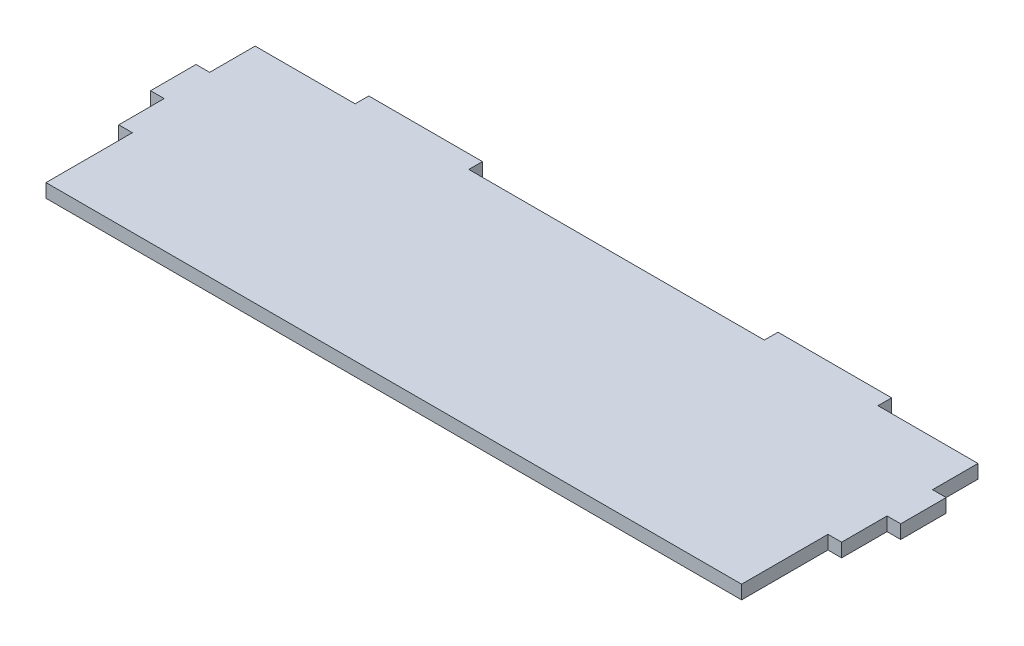
ISO-10303-21;
HEADER;
FILE_DESCRIPTION(('STEP AP214'),'2;1');
FILE_NAME('part.step','',(''),(''),'','','');
FILE_SCHEMA(('AUTOMOTIVE_DESIGN { 1 0 10303 214 1 1 1 1 }'));
ENDSEC;
DATA;
#1=APPLICATION_CONTEXT('core data for automotive mechanical design processes');
#2=APPLICATION_PROTOCOL_DEFINITION('international standard','automotive_design',2000,#1);
#3=PRODUCT_CONTEXT('',#1,'mechanical');
#4=PRODUCT('Part','Part','',(#3));
#5=PRODUCT_RELATED_PRODUCT_CATEGORY('part','',(#4));
#6=PRODUCT_DEFINITION_FORMATION('','',#4);
#7=PRODUCT_DEFINITION_CONTEXT('part definition',#1,'design');
#8=PRODUCT_DEFINITION('design','',#6,#7);
#9=PRODUCT_DEFINITION_SHAPE('','',#8);
#10=(LENGTH_UNIT() NAMED_UNIT(*) SI_UNIT(.MILLI.,.METRE.));
#11=(NAMED_UNIT(*) PLANE_ANGLE_UNIT() SI_UNIT($,.RADIAN.));
#12=(NAMED_UNIT(*) SI_UNIT($,.STERADIAN.) SOLID_ANGLE_UNIT());
#13=UNCERTAINTY_MEASURE_WITH_UNIT(LENGTH_MEASURE(1.E-05),#10,'distance_accuracy_value','');
#14=(GEOMETRIC_REPRESENTATION_CONTEXT(3) GLOBAL_UNCERTAINTY_ASSIGNED_CONTEXT((#13)) GLOBAL_UNIT_ASSIGNED_CONTEXT((#10,
#11,#12)) REPRESENTATION_CONTEXT('',''));
#15=CARTESIAN_POINT('',(0.,0.,0.));
#16=DIRECTION('',(0.,0.,1.));
#17=DIRECTION('',(1.,0.,0.));
#18=AXIS2_PLACEMENT_3D('',#15,#16,#17);
#19=CARTESIAN_POINT('',(-57.5,3.,-24.9711538461538));
#20=DIRECTION('',(0.,0.,1.));
#21=DIRECTION('',(1.,0.,0.));
#22=AXIS2_PLACEMENT_3D('',#19,#20,#21);
#23=PLANE('',#22);
#24=DIRECTION('',(-1.,0.,0.));
#25=VECTOR('',#24,1.);
#26=CARTESIAN_POINT('',(-57.5,0.,-24.9711538461538));
#27=LINE('',#26,#25);
#28=CARTESIAN_POINT('',(-57.5,0.,-24.9711538461538));
#29=VERTEX_POINT('',#28);
#30=CARTESIAN_POINT('',(-79.5,0.,-24.9711538461538));
#31=VERTEX_POINT('',#30);
#32=EDGE_CURVE('E225',#29,#31,#27,.T.);
#33=ORIENTED_EDGE('',*,*,#32,.T.);
#34=DIRECTION('',(0.,-1.,0.));
#35=VECTOR('',#34,1.);
#36=CARTESIAN_POINT('',(-79.5,3.,-24.9711538461538));
#37=LINE('',#36,#35);
#38=CARTESIAN_POINT('',(-79.5,3.,-24.9711538461538));
#39=VERTEX_POINT('',#38);
#40=EDGE_CURVE('E11',#39,#31,#37,.T.);
#41=ORIENTED_EDGE('',*,*,#40,.F.);
#42=DIRECTION('',(-1.,0.,0.));
#43=VECTOR('',#42,1.);
#44=CARTESIAN_POINT('',(-57.5,3.,-24.9711538461538));
#45=LINE('',#44,#43);
#46=CARTESIAN_POINT('',(-57.5,3.,-24.9711538461538));
#47=VERTEX_POINT('',#46);
#48=EDGE_CURVE('E271',#47,#39,#45,.T.);
#49=ORIENTED_EDGE('',*,*,#48,.F.);
#50=DIRECTION('',(0.,-1.,0.));
#51=VECTOR('',#50,1.);
#52=CARTESIAN_POINT('',(-57.5,3.,-24.9711538461538));
#53=LINE('',#52,#51);
#54=EDGE_CURVE('E221',#47,#29,#53,.T.);
#55=ORIENTED_EDGE('',*,*,#54,.T.);
#56=EDGE_LOOP('',(#33,#41,#49,#55));
#57=FACE_BOUND('',#56,.T.);
#58=ADVANCED_FACE('F33',(#57),#23,.F.);
#59=CARTESIAN_POINT('',(-79.5,3.,-14.9711538461539));
#60=DIRECTION('',(1.,0.,0.));
#61=DIRECTION('',(0.,0.,-1.));
#62=AXIS2_PLACEMENT_3D('',#59,#60,#61);
#63=PLANE('',#62);
#64=DIRECTION('',(0.,0.,1.));
#65=VECTOR('',#64,1.);
#66=CARTESIAN_POINT('',(-79.5,0.,-14.9711538461539));
#67=LINE('',#66,#65);
#68=CARTESIAN_POINT('',(-79.5,0.,-14.9711538461539));
#69=VERTEX_POINT('',#68);
#70=EDGE_CURVE('E228',#31,#69,#67,.T.);
#71=ORIENTED_EDGE('',*,*,#70,.T.);
#72=DIRECTION('',(0.,-1.,0.));
#73=VECTOR('',#72,1.);
#74=CARTESIAN_POINT('',(-79.5,3.,-14.9711538461539));
#75=LINE('',#74,#73);
#76=CARTESIAN_POINT('',(-79.5,3.,-14.9711538461539));
#77=VERTEX_POINT('',#76);
#78=EDGE_CURVE('E41',#77,#69,#75,.T.);
#79=ORIENTED_EDGE('',*,*,#78,.F.);
#80=DIRECTION('',(0.,0.,1.));
#81=VECTOR('',#80,1.);
#82=CARTESIAN_POINT('',(-79.5,3.,-14.9711538461539));
#83=LINE('',#82,#81);
#84=EDGE_CURVE('E140',#39,#77,#83,.T.);
#85=ORIENTED_EDGE('',*,*,#84,.F.);
#86=ORIENTED_EDGE('',*,*,#40,.T.);
#87=EDGE_LOOP('',(#71,#79,#85,#86));
#88=FACE_BOUND('',#87,.T.);
#89=ADVANCED_FACE('F409',(#88),#63,.F.);
#90=CARTESIAN_POINT('',(-79.5,3.,-14.9711538461539));
#91=DIRECTION('',(0.,0.,1.));
#92=DIRECTION('',(1.,0.,0.));
#93=AXIS2_PLACEMENT_3D('',#90,#91,#92);
#94=PLANE('',#93);
#95=DIRECTION('',(-1.,0.,0.));
#96=VECTOR('',#95,1.);
#97=CARTESIAN_POINT('',(-79.5,0.,-14.9711538461539));
#98=LINE('',#97,#96);
#99=CARTESIAN_POINT('',(-82.5,0.,-14.9711538461539));
#100=VERTEX_POINT('',#99);
#101=EDGE_CURVE('E230',#69,#100,#98,.T.);
#102=ORIENTED_EDGE('',*,*,#101,.T.);
#103=DIRECTION('',(0.,-1.,0.));
#104=VECTOR('',#103,1.);
#105=CARTESIAN_POINT('',(-82.5,3.,-14.9711538461539));
#106=LINE('',#105,#104);
#107=CARTESIAN_POINT('',(-82.5,3.,-14.9711538461539));
#108=VERTEX_POINT('',#107);
#109=EDGE_CURVE('E326',#108,#100,#106,.T.);
#110=ORIENTED_EDGE('',*,*,#109,.F.);
#111=DIRECTION('',(-1.,0.,0.));
#112=VECTOR('',#111,1.);
#113=CARTESIAN_POINT('',(-79.5,3.,-14.9711538461539));
#114=LINE('',#113,#112);
#115=EDGE_CURVE('E334',#77,#108,#114,.T.);
#116=ORIENTED_EDGE('',*,*,#115,.F.);
#117=ORIENTED_EDGE('',*,*,#78,.T.);
#118=EDGE_LOOP('',(#102,#110,#116,#117));
#119=FACE_BOUND('',#118,.T.);
#120=ADVANCED_FACE('F332',(#119),#94,.F.);
#121=CARTESIAN_POINT('',(-82.5,3.,-14.9711538461539));
#122=DIRECTION('',(1.,0.,0.));
#123=DIRECTION('',(0.,0.,-1.));
#124=AXIS2_PLACEMENT_3D('',#121,#122,#123);
#125=PLANE('',#124);
#126=DIRECTION('',(0.,0.,1.));
#127=VECTOR('',#126,1.);
#128=CARTESIAN_POINT('',(-82.5,0.,-14.9711538461539));
#129=LINE('',#128,#127);
#130=CARTESIAN_POINT('',(-82.5,0.,-4.97115384615383));
#131=VERTEX_POINT('',#130);
#132=EDGE_CURVE('E232',#100,#131,#129,.T.);
#133=ORIENTED_EDGE('',*,*,#132,.T.);
#134=DIRECTION('',(0.,-1.,0.));
#135=VECTOR('',#134,1.);
#136=CARTESIAN_POINT('',(-82.5,3.,-4.97115384615383));
#137=LINE('',#136,#135);
#138=CARTESIAN_POINT('',(-82.5,3.,-4.97115384615383));
#139=VERTEX_POINT('',#138);
#140=EDGE_CURVE('E323',#139,#131,#137,.T.);
#141=ORIENTED_EDGE('',*,*,#140,.F.);
#142=DIRECTION('',(0.,0.,1.));
#143=VECTOR('',#142,1.);
#144=CARTESIAN_POINT('',(-82.5,3.,-14.9711538461539));
#145=LINE('',#144,#143);
#146=EDGE_CURVE('E352',#108,#139,#145,.T.);
#147=ORIENTED_EDGE('',*,*,#146,.F.);
#148=ORIENTED_EDGE('',*,*,#109,.T.);
#149=EDGE_LOOP('',(#133,#141,#147,#148));
#150=FACE_BOUND('',#149,.T.);
#151=ADVANCED_FACE('F343',(#150),#125,.F.);
#152=CARTESIAN_POINT('',(-79.5,3.,-4.97115384615383));
#153=DIRECTION('',(0.,0.,-1.));
#154=DIRECTION('',(-1.,0.,0.));
#155=AXIS2_PLACEMENT_3D('',#152,#153,#154);
#156=PLANE('',#155);
#157=DIRECTION('',(1.,0.,0.));
#158=VECTOR('',#157,1.);
#159=CARTESIAN_POINT('',(-79.5,0.,-4.97115384615383));
#160=LINE('',#159,#158);
#161=CARTESIAN_POINT('',(-79.5,0.,-4.97115384615383));
#162=VERTEX_POINT('',#161);
#163=EDGE_CURVE('E234',#131,#162,#160,.T.);
#164=ORIENTED_EDGE('',*,*,#163,.T.);
#165=DIRECTION('',(0.,-1.,0.));
#166=VECTOR('',#165,1.);
#167=CARTESIAN_POINT('',(-79.5,3.,-4.97115384615383));
#168=LINE('',#167,#166);
#169=CARTESIAN_POINT('',(-79.5,3.,-4.97115384615383));
#170=VERTEX_POINT('',#169);
#171=EDGE_CURVE('E320',#170,#162,#168,.T.);
#172=ORIENTED_EDGE('',*,*,#171,.F.);
#173=DIRECTION('',(1.,0.,0.));
#174=VECTOR('',#173,1.);
#175=CARTESIAN_POINT('',(-79.5,3.,-4.97115384615383));
#176=LINE('',#175,#174);
#177=EDGE_CURVE('E349',#139,#170,#176,.T.);
#178=ORIENTED_EDGE('',*,*,#177,.F.);
#179=ORIENTED_EDGE('',*,*,#140,.T.);
#180=EDGE_LOOP('',(#164,#172,#178,#179));
#181=FACE_BOUND('',#180,.T.);
#182=ADVANCED_FACE('F347',(#181),#156,.F.);
#183=CARTESIAN_POINT('',(-79.5,3.,5.02884615384617));
#184=DIRECTION('',(1.,0.,0.));
#185=DIRECTION('',(0.,0.,-1.));
#186=AXIS2_PLACEMENT_3D('',#183,#184,#185);
#187=PLANE('',#186);
#188=DIRECTION('',(0.,0.,1.));
#189=VECTOR('',#188,1.);
#190=CARTESIAN_POINT('',(-79.5,0.,5.02884615384617));
#191=LINE('',#190,#189);
#192=CARTESIAN_POINT('',(-79.5,0.,5.02884615384617));
#193=VERTEX_POINT('',#192);
#194=EDGE_CURVE('E236',#162,#193,#191,.T.);
#195=ORIENTED_EDGE('',*,*,#194,.T.);
#196=DIRECTION('',(0.,-1.,0.));
#197=VECTOR('',#196,1.);
#198=CARTESIAN_POINT('',(-79.5,3.,5.02884615384617));
#199=LINE('',#198,#197);
#200=CARTESIAN_POINT('',(-79.5,3.,5.02884615384617));
#201=VERTEX_POINT('',#200);
#202=EDGE_CURVE('E317',#201,#193,#199,.T.);
#203=ORIENTED_EDGE('',*,*,#202,.F.);
#204=DIRECTION('',(0.,0.,1.));
#205=VECTOR('',#204,1.);
#206=CARTESIAN_POINT('',(-79.5,3.,5.02884615384617));
#207=LINE('',#206,#205);
#208=EDGE_CURVE('E351',#170,#201,#207,.T.);
#209=ORIENTED_EDGE('',*,*,#208,.F.);
#210=ORIENTED_EDGE('',*,*,#171,.T.);
#211=EDGE_LOOP('',(#195,#203,#209,#210));
#212=FACE_BOUND('',#211,.T.);
#213=ADVANCED_FACE('F422',(#212),#187,.F.);
#214=CARTESIAN_POINT('',(-79.5,3.,5.02884615384617));
#215=DIRECTION('',(0.,0.,-1.));
#216=DIRECTION('',(-1.,0.,0.));
#217=AXIS2_PLACEMENT_3D('',#214,#215,#216);
#218=PLANE('',#217);
#219=DIRECTION('',(1.,0.,0.));
#220=VECTOR('',#219,1.);
#221=CARTESIAN_POINT('',(-79.5,0.,5.02884615384617));
#222=LINE('',#221,#220);
#223=CARTESIAN_POINT('',(-76.5,0.,5.02884615384617));
#224=VERTEX_POINT('',#223);
#225=EDGE_CURVE('E238',#193,#224,#222,.T.);
#226=ORIENTED_EDGE('',*,*,#225,.T.);
#227=DIRECTION('',(0.,-1.,0.));
#228=VECTOR('',#227,1.);
#229=CARTESIAN_POINT('',(-76.5,3.,5.02884615384617));
#230=LINE('',#229,#228);
#231=CARTESIAN_POINT('',(-76.5,3.,5.02884615384617));
#232=VERTEX_POINT('',#231);
#233=EDGE_CURVE('E314',#232,#224,#230,.T.);
#234=ORIENTED_EDGE('',*,*,#233,.F.);
#235=DIRECTION('',(1.,0.,0.));
#236=VECTOR('',#235,1.);
#237=CARTESIAN_POINT('',(-79.5,3.,5.02884615384617));
#238=LINE('',#237,#236);
#239=EDGE_CURVE('E354',#201,#232,#238,.T.);
#240=ORIENTED_EDGE('',*,*,#239,.F.);
#241=ORIENTED_EDGE('',*,*,#202,.T.);
#242=EDGE_LOOP('',(#226,#234,#240,#241));
#243=FACE_BOUND('',#242,.T.);
#244=ADVANCED_FACE('F425',(#243),#218,.F.);
#245=CARTESIAN_POINT('',(-76.5,3.,5.02884615384617));
#246=DIRECTION('',(1.,0.,0.));
#247=DIRECTION('',(0.,0.,-1.));
#248=AXIS2_PLACEMENT_3D('',#245,#246,#247);
#249=PLANE('',#248);
#250=DIRECTION('',(0.,0.,1.));
#251=VECTOR('',#250,1.);
#252=CARTESIAN_POINT('',(-76.5,0.,5.02884615384617));
#253=LINE('',#252,#251);
#254=CARTESIAN_POINT('',(-76.5,0.,24.0288461538461));
#255=VERTEX_POINT('',#254);
#256=EDGE_CURVE('E240',#224,#255,#253,.T.);
#257=ORIENTED_EDGE('',*,*,#256,.T.);
#258=DIRECTION('',(0.,-1.,0.));
#259=VECTOR('',#258,1.);
#260=CARTESIAN_POINT('',(-76.5,3.,24.0288461538461));
#261=LINE('',#260,#259);
#262=CARTESIAN_POINT('',(-76.5,3.,24.0288461538461));
#263=VERTEX_POINT('',#262);
#264=EDGE_CURVE('E311',#263,#255,#261,.T.);
#265=ORIENTED_EDGE('',*,*,#264,.F.);
#266=DIRECTION('',(0.,0.,1.));
#267=VECTOR('',#266,1.);
#268=CARTESIAN_POINT('',(-76.5,3.,5.02884615384617));
#269=LINE('',#268,#267);
#270=EDGE_CURVE('E360',#232,#263,#269,.T.);
#271=ORIENTED_EDGE('',*,*,#270,.F.);
#272=ORIENTED_EDGE('',*,*,#233,.T.);
#273=EDGE_LOOP('',(#257,#265,#271,#272));
#274=FACE_BOUND('',#273,.T.);
#275=ADVANCED_FACE('F429',(#274),#249,.F.);
#276=CARTESIAN_POINT('',(76.5,3.,24.0288461538461));
#277=DIRECTION('',(0.,0.,-1.));
#278=DIRECTION('',(-1.,0.,0.));
#279=AXIS2_PLACEMENT_3D('',#276,#277,#278);
#280=PLANE('',#279);
#281=DIRECTION('',(1.,0.,0.));
#282=VECTOR('',#281,1.);
#283=CARTESIAN_POINT('',(76.5,0.,24.0288461538461));
#284=LINE('',#283,#282);
#285=CARTESIAN_POINT('',(76.5,0.,24.0288461538461));
#286=VERTEX_POINT('',#285);
#287=EDGE_CURVE('E242',#255,#286,#284,.T.);
#288=ORIENTED_EDGE('',*,*,#287,.T.);
#289=DIRECTION('',(0.,-1.,0.));
#290=VECTOR('',#289,1.);
#291=CARTESIAN_POINT('',(76.5,3.,24.0288461538461));
#292=LINE('',#291,#290);
#293=CARTESIAN_POINT('',(76.5,3.,24.0288461538461));
#294=VERTEX_POINT('',#293);
#295=EDGE_CURVE('E308',#294,#286,#292,.T.);
#296=ORIENTED_EDGE('',*,*,#295,.F.);
#297=DIRECTION('',(1.,0.,0.));
#298=VECTOR('',#297,1.);
#299=CARTESIAN_POINT('',(76.5,3.,24.0288461538461));
#300=LINE('',#299,#298);
#301=EDGE_CURVE('E362',#263,#294,#300,.T.);
#302=ORIENTED_EDGE('',*,*,#301,.F.);
#303=ORIENTED_EDGE('',*,*,#264,.T.);
#304=EDGE_LOOP('',(#288,#296,#302,#303));
#305=FACE_BOUND('',#304,.T.);
#306=ADVANCED_FACE('F433',(#305),#280,.F.);
#307=CARTESIAN_POINT('',(76.5,3.,5.02884615384617));
#308=DIRECTION('',(-1.,0.,0.));
#309=DIRECTION('',(0.,0.,1.));
#310=AXIS2_PLACEMENT_3D('',#307,#308,#309);
#311=PLANE('',#310);
#312=DIRECTION('',(0.,0.,-1.));
#313=VECTOR('',#312,1.);
#314=CARTESIAN_POINT('',(76.5,0.,5.02884615384617));
#315=LINE('',#314,#313);
#316=CARTESIAN_POINT('',(76.5,0.,5.02884615384617));
#317=VERTEX_POINT('',#316);
#318=EDGE_CURVE('E244',#286,#317,#315,.T.);
#319=ORIENTED_EDGE('',*,*,#318,.T.);
#320=DIRECTION('',(0.,-1.,0.));
#321=VECTOR('',#320,1.);
#322=CARTESIAN_POINT('',(76.5,3.,5.02884615384617));
#323=LINE('',#322,#321);
#324=CARTESIAN_POINT('',(76.5,3.,5.02884615384617));
#325=VERTEX_POINT('',#324);
#326=EDGE_CURVE('E305',#325,#317,#323,.T.);
#327=ORIENTED_EDGE('',*,*,#326,.F.);
#328=DIRECTION('',(0.,0.,-1.));
#329=VECTOR('',#328,1.);
#330=CARTESIAN_POINT('',(76.5,3.,5.02884615384617));
#331=LINE('',#330,#329);
#332=EDGE_CURVE('E364',#294,#325,#331,.T.);
#333=ORIENTED_EDGE('',*,*,#332,.F.);
#334=ORIENTED_EDGE('',*,*,#295,.T.);
#335=EDGE_LOOP('',(#319,#327,#333,#334));
#336=FACE_BOUND('',#335,.T.);
#337=ADVANCED_FACE('F437',(#336),#311,.F.);
#338=CARTESIAN_POINT('',(79.5,3.,5.02884615384617));
#339=DIRECTION('',(0.,0.,-1.));
#340=DIRECTION('',(-1.,0.,0.));
#341=AXIS2_PLACEMENT_3D('',#338,#339,#340);
#342=PLANE('',#341);
#343=DIRECTION('',(1.,0.,0.));
#344=VECTOR('',#343,1.);
#345=CARTESIAN_POINT('',(79.5,0.,5.02884615384617));
#346=LINE('',#345,#344);
#347=CARTESIAN_POINT('',(79.5,0.,5.02884615384617));
#348=VERTEX_POINT('',#347);
#349=EDGE_CURVE('E246',#317,#348,#346,.T.);
#350=ORIENTED_EDGE('',*,*,#349,.T.);
#351=DIRECTION('',(0.,-1.,0.));
#352=VECTOR('',#351,1.);
#353=CARTESIAN_POINT('',(79.5,3.,5.02884615384617));
#354=LINE('',#353,#352);
#355=CARTESIAN_POINT('',(79.5,3.,5.02884615384617));
#356=VERTEX_POINT('',#355);
#357=EDGE_CURVE('E302',#356,#348,#354,.T.);
#358=ORIENTED_EDGE('',*,*,#357,.F.);
#359=DIRECTION('',(1.,0.,0.));
#360=VECTOR('',#359,1.);
#361=CARTESIAN_POINT('',(79.5,3.,5.02884615384617));
#362=LINE('',#361,#360);
#363=EDGE_CURVE('E366',#325,#356,#362,.T.);
#364=ORIENTED_EDGE('',*,*,#363,.F.);
#365=ORIENTED_EDGE('',*,*,#326,.T.);
#366=EDGE_LOOP('',(#350,#358,#364,#365));
#367=FACE_BOUND('',#366,.T.);
#368=ADVANCED_FACE('F441',(#367),#342,.F.);
#369=CARTESIAN_POINT('',(79.5,3.,5.02884615384617));
#370=DIRECTION('',(-1.,0.,0.));
#371=DIRECTION('',(0.,0.,1.));
#372=AXIS2_PLACEMENT_3D('',#369,#370,#371);
#373=PLANE('',#372);
#374=DIRECTION('',(0.,0.,-1.));
#375=VECTOR('',#374,1.);
#376=CARTESIAN_POINT('',(79.5,0.,5.02884615384617));
#377=LINE('',#376,#375);
#378=CARTESIAN_POINT('',(79.5,0.,-4.97115384615383));
#379=VERTEX_POINT('',#378);
#380=EDGE_CURVE('E248',#348,#379,#377,.T.);
#381=ORIENTED_EDGE('',*,*,#380,.T.);
#382=DIRECTION('',(0.,-1.,0.));
#383=VECTOR('',#382,1.);
#384=CARTESIAN_POINT('',(79.5,3.,-4.97115384615383));
#385=LINE('',#384,#383);
#386=CARTESIAN_POINT('',(79.5,3.,-4.97115384615383));
#387=VERTEX_POINT('',#386);
#388=EDGE_CURVE('E299',#387,#379,#385,.T.);
#389=ORIENTED_EDGE('',*,*,#388,.F.);
#390=DIRECTION('',(0.,0.,-1.));
#391=VECTOR('',#390,1.);
#392=CARTESIAN_POINT('',(79.5,3.,5.02884615384617));
#393=LINE('',#392,#391);
#394=EDGE_CURVE('E368',#356,#387,#393,.T.);
#395=ORIENTED_EDGE('',*,*,#394,.F.);
#396=ORIENTED_EDGE('',*,*,#357,.T.);
#397=EDGE_LOOP('',(#381,#389,#395,#396));
#398=FACE_BOUND('',#397,.T.);
#399=ADVANCED_FACE('F445',(#398),#373,.F.);
#400=CARTESIAN_POINT('',(79.5,3.,-4.97115384615383));
#401=DIRECTION('',(0.,0.,-1.));
#402=DIRECTION('',(-1.,0.,0.));
#403=AXIS2_PLACEMENT_3D('',#400,#401,#402);
#404=PLANE('',#403);
#405=DIRECTION('',(1.,0.,0.));
#406=VECTOR('',#405,1.);
#407=CARTESIAN_POINT('',(79.5,0.,-4.97115384615383));
#408=LINE('',#407,#406);
#409=CARTESIAN_POINT('',(82.5000000000001,0.,-4.97115384615383));
#410=VERTEX_POINT('',#409);
#411=EDGE_CURVE('E250',#379,#410,#408,.T.);
#412=ORIENTED_EDGE('',*,*,#411,.T.);
#413=DIRECTION('',(0.,-1.,0.));
#414=VECTOR('',#413,1.);
#415=CARTESIAN_POINT('',(82.5000000000001,3.,-4.97115384615383));
#416=LINE('',#415,#414);
#417=CARTESIAN_POINT('',(82.5000000000001,3.,-4.97115384615383));
#418=VERTEX_POINT('',#417);
#419=EDGE_CURVE('E296',#418,#410,#416,.T.);
#420=ORIENTED_EDGE('',*,*,#419,.F.);
#421=DIRECTION('',(1.,0.,0.));
#422=VECTOR('',#421,1.);
#423=CARTESIAN_POINT('',(79.5,3.,-4.97115384615383));
#424=LINE('',#423,#422);
#425=EDGE_CURVE('E370',#387,#418,#424,.T.);
#426=ORIENTED_EDGE('',*,*,#425,.F.);
#427=ORIENTED_EDGE('',*,*,#388,.T.);
#428=EDGE_LOOP('',(#412,#420,#426,#427));
#429=FACE_BOUND('',#428,.T.);
#430=ADVANCED_FACE('F449',(#429),#404,.F.);
#431=CARTESIAN_POINT('',(82.5,3.,-14.9711538461539));
#432=DIRECTION('',(-1.,0.,0.));
#433=DIRECTION('',(0.,0.,1.));
#434=AXIS2_PLACEMENT_3D('',#431,#432,#433);
#435=PLANE('',#434);
#436=DIRECTION('',(0.,0.,-1.));
#437=VECTOR('',#436,1.);
#438=CARTESIAN_POINT('',(82.5,0.,-14.9711538461539));
#439=LINE('',#438,#437);
#440=CARTESIAN_POINT('',(82.5,0.,-14.9711538461539));
#441=VERTEX_POINT('',#440);
#442=EDGE_CURVE('E252',#410,#441,#439,.T.);
#443=ORIENTED_EDGE('',*,*,#442,.T.);
#444=DIRECTION('',(0.,-1.,0.));
#445=VECTOR('',#444,1.);
#446=CARTESIAN_POINT('',(82.5,3.,-14.9711538461539));
#447=LINE('',#446,#445);
#448=CARTESIAN_POINT('',(82.5,3.,-14.9711538461539));
#449=VERTEX_POINT('',#448);
#450=EDGE_CURVE('E293',#449,#441,#447,.T.);
#451=ORIENTED_EDGE('',*,*,#450,.F.);
#452=DIRECTION('',(0.,0.,-1.));
#453=VECTOR('',#452,1.);
#454=CARTESIAN_POINT('',(82.5,3.,-14.9711538461539));
#455=LINE('',#454,#453);
#456=EDGE_CURVE('E372',#418,#449,#455,.T.);
#457=ORIENTED_EDGE('',*,*,#456,.F.);
#458=ORIENTED_EDGE('',*,*,#419,.T.);
#459=EDGE_LOOP('',(#443,#451,#457,#458));
#460=FACE_BOUND('',#459,.T.);
#461=ADVANCED_FACE('F453',(#460),#435,.F.);
#462=CARTESIAN_POINT('',(79.5,3.,-14.9711538461539));
#463=DIRECTION('',(0.,0.,1.));
#464=DIRECTION('',(1.,0.,0.));
#465=AXIS2_PLACEMENT_3D('',#462,#463,#464);
#466=PLANE('',#465);
#467=DIRECTION('',(-1.,0.,0.));
#468=VECTOR('',#467,1.);
#469=CARTESIAN_POINT('',(79.5,0.,-14.9711538461539));
#470=LINE('',#469,#468);
#471=CARTESIAN_POINT('',(79.5,0.,-14.9711538461539));
#472=VERTEX_POINT('',#471);
#473=EDGE_CURVE('E254',#441,#472,#470,.T.);
#474=ORIENTED_EDGE('',*,*,#473,.T.);
#475=DIRECTION('',(0.,-1.,0.));
#476=VECTOR('',#475,1.);
#477=CARTESIAN_POINT('',(79.5,3.,-14.9711538461539));
#478=LINE('',#477,#476);
#479=CARTESIAN_POINT('',(79.5,3.,-14.9711538461539));
#480=VERTEX_POINT('',#479);
#481=EDGE_CURVE('E290',#480,#472,#478,.T.);
#482=ORIENTED_EDGE('',*,*,#481,.F.);
#483=DIRECTION('',(-1.,0.,0.));
#484=VECTOR('',#483,1.);
#485=CARTESIAN_POINT('',(79.5,3.,-14.9711538461539));
#486=LINE('',#485,#484);
#487=EDGE_CURVE('E374',#449,#480,#486,.T.);
#488=ORIENTED_EDGE('',*,*,#487,.F.);
#489=ORIENTED_EDGE('',*,*,#450,.T.);
#490=EDGE_LOOP('',(#474,#482,#488,#489));
#491=FACE_BOUND('',#490,.T.);
#492=ADVANCED_FACE('F457',(#491),#466,.F.);
#493=CARTESIAN_POINT('',(79.5,3.,-14.9711538461539));
#494=DIRECTION('',(-1.,0.,0.));
#495=DIRECTION('',(0.,0.,1.));
#496=AXIS2_PLACEMENT_3D('',#493,#494,#495);
#497=PLANE('',#496);
#498=DIRECTION('',(0.,0.,-1.));
#499=VECTOR('',#498,1.);
#500=CARTESIAN_POINT('',(79.5,0.,-14.9711538461539));
#501=LINE('',#500,#499);
#502=CARTESIAN_POINT('',(79.5,0.,-24.9711538461539));
#503=VERTEX_POINT('',#502);
#504=EDGE_CURVE('E256',#472,#503,#501,.T.);
#505=ORIENTED_EDGE('',*,*,#504,.T.);
#506=DIRECTION('',(0.,-1.,0.));
#507=VECTOR('',#506,1.);
#508=CARTESIAN_POINT('',(79.5,3.,-24.9711538461539));
#509=LINE('',#508,#507);
#510=CARTESIAN_POINT('',(79.5,3.,-24.9711538461539));
#511=VERTEX_POINT('',#510);
#512=EDGE_CURVE('E287',#511,#503,#509,.T.);
#513=ORIENTED_EDGE('',*,*,#512,.F.);
#514=DIRECTION('',(0.,0.,-1.));
#515=VECTOR('',#514,1.);
#516=CARTESIAN_POINT('',(79.5,3.,-14.9711538461539));
#517=LINE('',#516,#515);
#518=EDGE_CURVE('E376',#480,#511,#517,.T.);
#519=ORIENTED_EDGE('',*,*,#518,.F.);
#520=ORIENTED_EDGE('',*,*,#481,.T.);
#521=EDGE_LOOP('',(#505,#513,#519,#520));
#522=FACE_BOUND('',#521,.T.);
#523=ADVANCED_FACE('F461',(#522),#497,.F.);
#524=CARTESIAN_POINT('',(79.5,3.,-24.9711538461539));
#525=DIRECTION('',(0.,0.,1.));
#526=DIRECTION('',(1.,0.,0.));
#527=AXIS2_PLACEMENT_3D('',#524,#525,#526);
#528=PLANE('',#527);
#529=DIRECTION('',(-1.,0.,0.));
#530=VECTOR('',#529,1.);
#531=CARTESIAN_POINT('',(79.5,0.,-24.9711538461539));
#532=LINE('',#531,#530);
#533=CARTESIAN_POINT('',(57.5,0.,-24.9711538461539));
#534=VERTEX_POINT('',#533);
#535=EDGE_CURVE('E258',#503,#534,#532,.T.);
#536=ORIENTED_EDGE('',*,*,#535,.T.);
#537=DIRECTION('',(0.,-1.,0.));
#538=VECTOR('',#537,1.);
#539=CARTESIAN_POINT('',(57.5,3.,-24.9711538461539));
#540=LINE('',#539,#538);
#541=CARTESIAN_POINT('',(57.5,3.,-24.9711538461539));
#542=VERTEX_POINT('',#541);
#543=EDGE_CURVE('E284',#542,#534,#540,.T.);
#544=ORIENTED_EDGE('',*,*,#543,.F.);
#545=DIRECTION('',(-1.,0.,0.));
#546=VECTOR('',#545,1.);
#547=CARTESIAN_POINT('',(79.5,3.,-24.9711538461539));
#548=LINE('',#547,#546);
#549=EDGE_CURVE('E378',#511,#542,#548,.T.);
#550=ORIENTED_EDGE('',*,*,#549,.F.);
#551=ORIENTED_EDGE('',*,*,#512,.T.);
#552=EDGE_LOOP('',(#536,#544,#550,#551));
#553=FACE_BOUND('',#552,.T.);
#554=ADVANCED_FACE('F465',(#553),#528,.F.);
#555=CARTESIAN_POINT('',(57.5,3.,-24.9711538461539));
#556=DIRECTION('',(-1.,0.,0.));
#557=DIRECTION('',(0.,0.,1.));
#558=AXIS2_PLACEMENT_3D('',#555,#556,#557);
#559=PLANE('',#558);
#560=DIRECTION('',(0.,0.,-1.));
#561=VECTOR('',#560,1.);
#562=CARTESIAN_POINT('',(57.5,0.,-24.9711538461539));
#563=LINE('',#562,#561);
#564=CARTESIAN_POINT('',(57.5,0.,-27.9711538461538));
#565=VERTEX_POINT('',#564);
#566=EDGE_CURVE('E260',#534,#565,#563,.T.);
#567=ORIENTED_EDGE('',*,*,#566,.T.);
#568=DIRECTION('',(0.,-1.,0.));
#569=VECTOR('',#568,1.);
#570=CARTESIAN_POINT('',(57.5,3.,-27.9711538461538));
#571=LINE('',#570,#569);
#572=CARTESIAN_POINT('',(57.5,3.,-27.9711538461538));
#573=VERTEX_POINT('',#572);
#574=EDGE_CURVE('E281',#573,#565,#571,.T.);
#575=ORIENTED_EDGE('',*,*,#574,.F.);
#576=DIRECTION('',(0.,0.,-1.));
#577=VECTOR('',#576,1.);
#578=CARTESIAN_POINT('',(57.5,3.,-24.9711538461539));
#579=LINE('',#578,#577);
#580=EDGE_CURVE('E380',#542,#573,#579,.T.);
#581=ORIENTED_EDGE('',*,*,#580,.F.);
#582=ORIENTED_EDGE('',*,*,#543,.T.);
#583=EDGE_LOOP('',(#567,#575,#581,#582));
#584=FACE_BOUND('',#583,.T.);
#585=ADVANCED_FACE('F469',(#584),#559,.F.);
#586=CARTESIAN_POINT('',(32.5,3.,-27.9711538461538));
#587=DIRECTION('',(0.,0.,1.));
#588=DIRECTION('',(1.,0.,0.));
#589=AXIS2_PLACEMENT_3D('',#586,#587,#588);
#590=PLANE('',#589);
#591=DIRECTION('',(-1.,0.,0.));
#592=VECTOR('',#591,1.);
#593=CARTESIAN_POINT('',(32.5,0.,-27.9711538461538));
#594=LINE('',#593,#592);
#595=CARTESIAN_POINT('',(32.5,0.,-27.9711538461538));
#596=VERTEX_POINT('',#595);
#597=EDGE_CURVE('E262',#565,#596,#594,.T.);
#598=ORIENTED_EDGE('',*,*,#597,.T.);
#599=DIRECTION('',(0.,-1.,0.));
#600=VECTOR('',#599,1.);
#601=CARTESIAN_POINT('',(32.5,3.,-27.9711538461538));
#602=LINE('',#601,#600);
#603=CARTESIAN_POINT('',(32.5,3.,-27.9711538461538));
#604=VERTEX_POINT('',#603);
#605=EDGE_CURVE('E278',#604,#596,#602,.T.);
#606=ORIENTED_EDGE('',*,*,#605,.F.);
#607=DIRECTION('',(-1.,0.,0.));
#608=VECTOR('',#607,1.);
#609=CARTESIAN_POINT('',(32.5,3.,-27.9711538461538));
#610=LINE('',#609,#608);
#611=EDGE_CURVE('E382',#573,#604,#610,.T.);
#612=ORIENTED_EDGE('',*,*,#611,.F.);
#613=ORIENTED_EDGE('',*,*,#574,.T.);
#614=EDGE_LOOP('',(#598,#606,#612,#613));
#615=FACE_BOUND('',#614,.T.);
#616=ADVANCED_FACE('F473',(#615),#590,.F.);
#617=CARTESIAN_POINT('',(32.5,3.,-24.9711538461539));
#618=DIRECTION('',(1.,0.,0.));
#619=DIRECTION('',(0.,0.,-1.));
#620=AXIS2_PLACEMENT_3D('',#617,#618,#619);
#621=PLANE('',#620);
#622=DIRECTION('',(0.,0.,1.));
#623=VECTOR('',#622,1.);
#624=CARTESIAN_POINT('',(32.5,0.,-24.9711538461539));
#625=LINE('',#624,#623);
#626=CARTESIAN_POINT('',(32.5,0.,-24.9711538461539));
#627=VERTEX_POINT('',#626);
#628=EDGE_CURVE('E264',#596,#627,#625,.T.);
#629=ORIENTED_EDGE('',*,*,#628,.T.);
#630=DIRECTION('',(0.,-1.,0.));
#631=VECTOR('',#630,1.);
#632=CARTESIAN_POINT('',(32.5,3.,-24.9711538461539));
#633=LINE('',#632,#631);
#634=CARTESIAN_POINT('',(32.5,3.,-24.9711538461539));
#635=VERTEX_POINT('',#634);
#636=EDGE_CURVE('E275',#635,#627,#633,.T.);
#637=ORIENTED_EDGE('',*,*,#636,.F.);
#638=DIRECTION('',(0.,0.,1.));
#639=VECTOR('',#638,1.);
#640=CARTESIAN_POINT('',(32.5,3.,-24.9711538461539));
#641=LINE('',#640,#639);
#642=EDGE_CURVE('E384',#604,#635,#641,.T.);
#643=ORIENTED_EDGE('',*,*,#642,.F.);
#644=ORIENTED_EDGE('',*,*,#605,.T.);
#645=EDGE_LOOP('',(#629,#637,#643,#644));
#646=FACE_BOUND('',#645,.T.);
#647=ADVANCED_FACE('F390',(#646),#621,.F.);
#648=CARTESIAN_POINT('',(32.5,3.,-24.9711538461539));
#649=DIRECTION('',(0.,0.,1.));
#650=DIRECTION('',(1.,0.,0.));
#651=AXIS2_PLACEMENT_3D('',#648,#649,#650);
#652=PLANE('',#651);
#653=DIRECTION('',(-1.,0.,0.));
#654=VECTOR('',#653,1.);
#655=CARTESIAN_POINT('',(32.5,0.,-24.9711538461539));
#656=LINE('',#655,#654);
#657=CARTESIAN_POINT('',(-32.5,0.,-24.9711538461538));
#658=VERTEX_POINT('',#657);
#659=EDGE_CURVE('E266',#627,#658,#656,.T.);
#660=ORIENTED_EDGE('',*,*,#659,.T.);
#661=DIRECTION('',(0.,-1.,0.));
#662=VECTOR('',#661,1.);
#663=CARTESIAN_POINT('',(-32.5,3.,-24.9711538461538));
#664=LINE('',#663,#662);
#665=CARTESIAN_POINT('',(-32.5,3.,-24.9711538461538));
#666=VERTEX_POINT('',#665);
#667=EDGE_CURVE('E216',#666,#658,#664,.T.);
#668=ORIENTED_EDGE('',*,*,#667,.F.);
#669=DIRECTION('',(-1.,0.,0.));
#670=VECTOR('',#669,1.);
#671=CARTESIAN_POINT('',(32.5,3.,-24.9711538461539));
#672=LINE('',#671,#670);
#673=EDGE_CURVE('E207',#635,#666,#672,.T.);
#674=ORIENTED_EDGE('',*,*,#673,.F.);
#675=ORIENTED_EDGE('',*,*,#636,.T.);
#676=EDGE_LOOP('',(#660,#668,#674,#675));
#677=FACE_BOUND('',#676,.T.);
#678=ADVANCED_FACE('F394',(#677),#652,.F.);
#679=CARTESIAN_POINT('',(-32.5,3.,-24.9711538461538));
#680=DIRECTION('',(-1.,0.,0.));
#681=DIRECTION('',(0.,0.,1.));
#682=AXIS2_PLACEMENT_3D('',#679,#680,#681);
#683=PLANE('',#682);
#684=DIRECTION('',(0.,0.,-1.));
#685=VECTOR('',#684,1.);
#686=CARTESIAN_POINT('',(-32.5,0.,-24.9711538461538));
#687=LINE('',#686,#685);
#688=CARTESIAN_POINT('',(-32.5,0.,-27.9711538461538));
#689=VERTEX_POINT('',#688);
#690=EDGE_CURVE('E215',#658,#689,#687,.T.);
#691=ORIENTED_EDGE('',*,*,#690,.T.);
#692=DIRECTION('',(0.,-1.,0.));
#693=VECTOR('',#692,1.);
#694=CARTESIAN_POINT('',(-32.5,3.,-27.9711538461538));
#695=LINE('',#694,#693);
#696=CARTESIAN_POINT('',(-32.5,3.,-27.9711538461538));
#697=VERTEX_POINT('',#696);
#698=EDGE_CURVE('E212',#697,#689,#695,.T.);
#699=ORIENTED_EDGE('',*,*,#698,.F.);
#700=DIRECTION('',(0.,0.,-1.));
#701=VECTOR('',#700,1.);
#702=CARTESIAN_POINT('',(-32.5,3.,-24.9711538461538));
#703=LINE('',#702,#701);
#704=EDGE_CURVE('E201',#666,#697,#703,.T.);
#705=ORIENTED_EDGE('',*,*,#704,.F.);
#706=ORIENTED_EDGE('',*,*,#667,.T.);
#707=EDGE_LOOP('',(#691,#699,#705,#706));
#708=FACE_BOUND('',#707,.T.);
#709=ADVANCED_FACE('F213',(#708),#683,.F.);
#710=CARTESIAN_POINT('',(-57.5,3.,-27.9711538461538));
#711=DIRECTION('',(0.,0.,1.));
#712=DIRECTION('',(1.,0.,0.));
#713=AXIS2_PLACEMENT_3D('',#710,#711,#712);
#714=PLANE('',#713);
#715=DIRECTION('',(-1.,0.,0.));
#716=VECTOR('',#715,1.);
#717=CARTESIAN_POINT('',(-57.5,0.,-27.9711538461538));
#718=LINE('',#717,#716);
#719=CARTESIAN_POINT('',(-57.5,0.,-27.9711538461538));
#720=VERTEX_POINT('',#719);
#721=EDGE_CURVE('E126',#689,#720,#718,.T.);
#722=ORIENTED_EDGE('',*,*,#721,.T.);
#723=DIRECTION('',(0.,-1.,0.));
#724=VECTOR('',#723,1.);
#725=CARTESIAN_POINT('',(-57.5,3.,-27.9711538461538));
#726=LINE('',#725,#724);
#727=CARTESIAN_POINT('',(-57.5,3.,-27.9711538461538));
#728=VERTEX_POINT('',#727);
#729=EDGE_CURVE('E217',#728,#720,#726,.T.);
#730=ORIENTED_EDGE('',*,*,#729,.F.);
#731=DIRECTION('',(-1.,0.,0.));
#732=VECTOR('',#731,1.);
#733=CARTESIAN_POINT('',(-57.5,3.,-27.9711538461538));
#734=LINE('',#733,#732);
#735=EDGE_CURVE('E205',#697,#728,#734,.T.);
#736=ORIENTED_EDGE('',*,*,#735,.F.);
#737=ORIENTED_EDGE('',*,*,#698,.T.);
#738=EDGE_LOOP('',(#722,#730,#736,#737));
#739=FACE_BOUND('',#738,.T.);
#740=ADVANCED_FACE('F219',(#739),#714,.F.);
#741=CARTESIAN_POINT('',(-57.5,3.,-24.9711538461538));
#742=DIRECTION('',(1.,0.,0.));
#743=DIRECTION('',(0.,0.,-1.));
#744=AXIS2_PLACEMENT_3D('',#741,#742,#743);
#745=PLANE('',#744);
#746=DIRECTION('',(0.,0.,1.));
#747=VECTOR('',#746,1.);
#748=CARTESIAN_POINT('',(-57.5,0.,-24.9711538461538));
#749=LINE('',#748,#747);
#750=EDGE_CURVE('E132',#720,#29,#749,.T.);
#751=ORIENTED_EDGE('',*,*,#750,.T.);
#752=ORIENTED_EDGE('',*,*,#54,.F.);
#753=DIRECTION('',(0.,0.,1.));
#754=VECTOR('',#753,1.);
#755=CARTESIAN_POINT('',(-57.5,3.,-24.9711538461538));
#756=LINE('',#755,#754);
#757=EDGE_CURVE('E49',#728,#47,#756,.T.);
#758=ORIENTED_EDGE('',*,*,#757,.F.);
#759=ORIENTED_EDGE('',*,*,#729,.T.);
#760=EDGE_LOOP('',(#751,#752,#758,#759));
#761=FACE_BOUND('',#760,.T.);
#762=ADVANCED_FACE('F398',(#761),#745,.F.);
#763=CARTESIAN_POINT('',(0.,3.,0.));
#764=DIRECTION('',(0.,-1.,0.));
#765=DIRECTION('',(0.,0.,-1.));
#766=AXIS2_PLACEMENT_3D('',#763,#764,#765);
#767=PLANE('',#766);
#768=ORIENTED_EDGE('',*,*,#48,.T.);
#769=ORIENTED_EDGE('',*,*,#84,.T.);
#770=ORIENTED_EDGE('',*,*,#115,.T.);
#771=ORIENTED_EDGE('',*,*,#146,.T.);
#772=ORIENTED_EDGE('',*,*,#177,.T.);
#773=ORIENTED_EDGE('',*,*,#208,.T.);
#774=ORIENTED_EDGE('',*,*,#239,.T.);
#775=ORIENTED_EDGE('',*,*,#270,.T.);
#776=ORIENTED_EDGE('',*,*,#301,.T.);
#777=ORIENTED_EDGE('',*,*,#332,.T.);
#778=ORIENTED_EDGE('',*,*,#363,.T.);
#779=ORIENTED_EDGE('',*,*,#394,.T.);
#780=ORIENTED_EDGE('',*,*,#425,.T.);
#781=ORIENTED_EDGE('',*,*,#456,.T.);
#782=ORIENTED_EDGE('',*,*,#487,.T.);
#783=ORIENTED_EDGE('',*,*,#518,.T.);
#784=ORIENTED_EDGE('',*,*,#549,.T.);
#785=ORIENTED_EDGE('',*,*,#580,.T.);
#786=ORIENTED_EDGE('',*,*,#611,.T.);
#787=ORIENTED_EDGE('',*,*,#642,.T.);
#788=ORIENTED_EDGE('',*,*,#673,.T.);
#789=ORIENTED_EDGE('',*,*,#704,.T.);
#790=ORIENTED_EDGE('',*,*,#735,.T.);
#791=ORIENTED_EDGE('',*,*,#757,.T.);
#792=EDGE_LOOP('',(#768,#769,#770,#771,#772,#773,#774,#775,#776,#777,#778,#779,#780,#781,#782,
#783,#784,#785,#786,#787,#788,#789,#790,#791));
#793=FACE_BOUND('',#792,.T.);
#794=ADVANCED_FACE('F203',(#793),#767,.F.);
#795=CARTESIAN_POINT('',(0.,0.,0.));
#796=DIRECTION('',(0.,-1.,0.));
#797=DIRECTION('',(0.,0.,-1.));
#798=AXIS2_PLACEMENT_3D('',#795,#796,#797);
#799=PLANE('',#798);
#800=ORIENTED_EDGE('',*,*,#32,.F.);
#801=ORIENTED_EDGE('',*,*,#750,.F.);
#802=ORIENTED_EDGE('',*,*,#721,.F.);
#803=ORIENTED_EDGE('',*,*,#690,.F.);
#804=ORIENTED_EDGE('',*,*,#659,.F.);
#805=ORIENTED_EDGE('',*,*,#628,.F.);
#806=ORIENTED_EDGE('',*,*,#597,.F.);
#807=ORIENTED_EDGE('',*,*,#566,.F.);
#808=ORIENTED_EDGE('',*,*,#535,.F.);
#809=ORIENTED_EDGE('',*,*,#504,.F.);
#810=ORIENTED_EDGE('',*,*,#473,.F.);
#811=ORIENTED_EDGE('',*,*,#442,.F.);
#812=ORIENTED_EDGE('',*,*,#411,.F.);
#813=ORIENTED_EDGE('',*,*,#380,.F.);
#814=ORIENTED_EDGE('',*,*,#349,.F.);
#815=ORIENTED_EDGE('',*,*,#318,.F.);
#816=ORIENTED_EDGE('',*,*,#287,.F.);
#817=ORIENTED_EDGE('',*,*,#256,.F.);
#818=ORIENTED_EDGE('',*,*,#225,.F.);
#819=ORIENTED_EDGE('',*,*,#194,.F.);
#820=ORIENTED_EDGE('',*,*,#163,.F.);
#821=ORIENTED_EDGE('',*,*,#132,.F.);
#822=ORIENTED_EDGE('',*,*,#101,.F.);
#823=ORIENTED_EDGE('',*,*,#70,.F.);
#824=EDGE_LOOP('',(#800,#801,#802,#803,#804,#805,#806,#807,#808,#809,#810,#811,#812,#813,#814,
#815,#816,#817,#818,#819,#820,#821,#822,#823));
#825=FACE_BOUND('',#824,.T.);
#826=ADVANCED_FACE('F338',(#825),#799,.T.);
#827=CLOSED_SHELL('',(#58,#89,#120,#151,#182,#213,#244,#275,#306,#337,#368,#399,#430,#461,#492,
#523,#554,#585,#616,#647,#678,#709,#740,#762,#794,#826));
#828=MANIFOLD_SOLID_BREP('B2',#827);
#829=ADVANCED_BREP_SHAPE_REPRESENTATION('',(#18,#828),#14);
#830=SHAPE_DEFINITION_REPRESENTATION(#9,#829);
ENDSEC;
END-ISO-10303-21;
